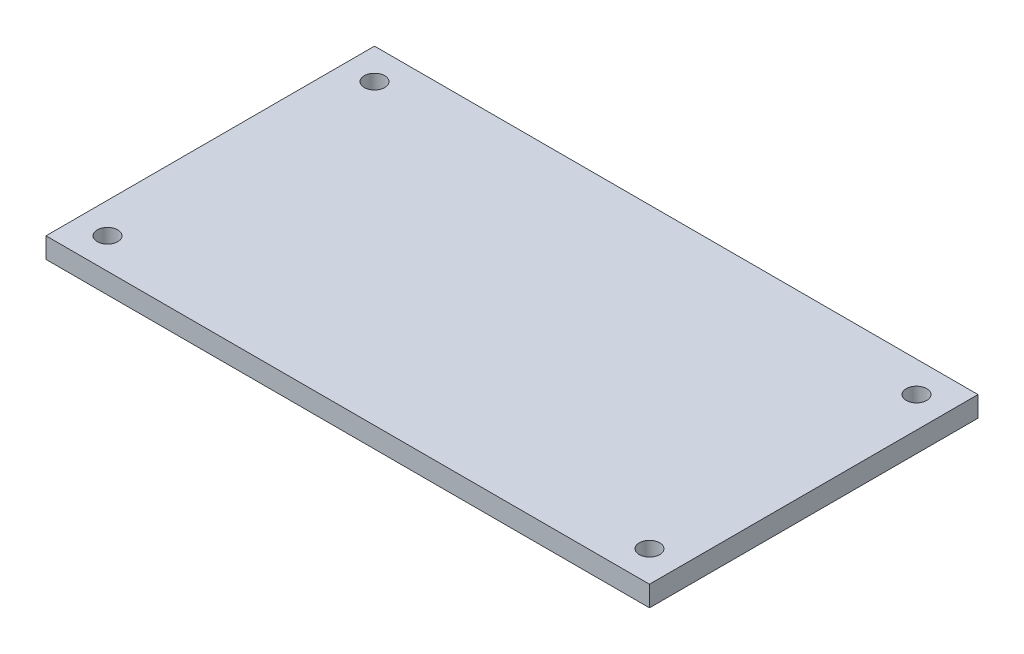
ISO-10303-21;
HEADER;
FILE_DESCRIPTION(('STEP AP214'),'2;1');
FILE_NAME('part.step','',(''),(''),'','','');
FILE_SCHEMA(('AUTOMOTIVE_DESIGN { 1 0 10303 214 1 1 1 1 }'));
ENDSEC;
DATA;
#1=APPLICATION_CONTEXT('core data for automotive mechanical design processes');
#2=APPLICATION_PROTOCOL_DEFINITION('international standard','automotive_design',2000,#1);
#3=PRODUCT_CONTEXT('',#1,'mechanical');
#4=PRODUCT('Part','Part','',(#3));
#5=PRODUCT_RELATED_PRODUCT_CATEGORY('part','',(#4));
#6=PRODUCT_DEFINITION_FORMATION('','',#4);
#7=PRODUCT_DEFINITION_CONTEXT('part definition',#1,'design');
#8=PRODUCT_DEFINITION('design','',#6,#7);
#9=PRODUCT_DEFINITION_SHAPE('','',#8);
#10=(LENGTH_UNIT() NAMED_UNIT(*) SI_UNIT(.MILLI.,.METRE.));
#11=(NAMED_UNIT(*) PLANE_ANGLE_UNIT() SI_UNIT($,.RADIAN.));
#12=(NAMED_UNIT(*) SI_UNIT($,.STERADIAN.) SOLID_ANGLE_UNIT());
#13=UNCERTAINTY_MEASURE_WITH_UNIT(LENGTH_MEASURE(1.E-05),#10,'distance_accuracy_value','');
#14=(GEOMETRIC_REPRESENTATION_CONTEXT(3) GLOBAL_UNCERTAINTY_ASSIGNED_CONTEXT((#13)) GLOBAL_UNIT_ASSIGNED_CONTEXT((#10,
#11,#12)) REPRESENTATION_CONTEXT('',''));
#15=CARTESIAN_POINT('',(0.,0.,0.));
#16=DIRECTION('',(0.,0.,1.));
#17=DIRECTION('',(1.,0.,0.));
#18=AXIS2_PLACEMENT_3D('',#15,#16,#17);
#19=CARTESIAN_POINT('',(0.,2.,-29.04));
#20=DIRECTION('',(0.,0.,-1.));
#21=DIRECTION('',(-1.,0.,0.));
#22=AXIS2_PLACEMENT_3D('',#19,#20,#21);
#23=PLANE('',#22);
#24=DIRECTION('',(1.,0.,0.));
#25=VECTOR('',#24,1.);
#26=CARTESIAN_POINT('',(0.,0.,-29.04));
#27=LINE('',#26,#25);
#28=CARTESIAN_POINT('',(-3.,0.,-29.04));
#29=VERTEX_POINT('',#28);
#30=CARTESIAN_POINT('',(55.86,0.,-29.04));
#31=VERTEX_POINT('',#30);
#32=EDGE_CURVE('E108',#29,#31,#27,.T.);
#33=ORIENTED_EDGE('',*,*,#32,.F.);
#34=DIRECTION('',(0.,-1.,0.));
#35=VECTOR('',#34,1.);
#36=CARTESIAN_POINT('',(-3.,2.,-29.04));
#37=LINE('',#36,#35);
#38=CARTESIAN_POINT('',(-3.,2.,-29.04));
#39=VERTEX_POINT('',#38);
#40=EDGE_CURVE('E11',#39,#29,#37,.T.);
#41=ORIENTED_EDGE('',*,*,#40,.F.);
#42=DIRECTION('',(1.,0.,0.));
#43=VECTOR('',#42,1.);
#44=CARTESIAN_POINT('',(0.,2.,-29.04));
#45=LINE('',#44,#43);
#46=CARTESIAN_POINT('',(55.86,2.,-29.04));
#47=VERTEX_POINT('',#46);
#48=EDGE_CURVE('E84',#39,#47,#45,.T.);
#49=ORIENTED_EDGE('',*,*,#48,.T.);
#50=DIRECTION('',(0.,-1.,0.));
#51=VECTOR('',#50,1.);
#52=CARTESIAN_POINT('',(55.86,2.,-29.04));
#53=LINE('',#52,#51);
#54=EDGE_CURVE('E72',#47,#31,#53,.T.);
#55=ORIENTED_EDGE('',*,*,#54,.T.);
#56=EDGE_LOOP('',(#33,#41,#49,#55));
#57=FACE_BOUND('',#56,.T.);
#58=ADVANCED_FACE('F33',(#57),#23,.T.);
#59=CARTESIAN_POINT('',(-3.,2.,0.));
#60=DIRECTION('',(1.,0.,0.));
#61=DIRECTION('',(0.,0.,-1.));
#62=AXIS2_PLACEMENT_3D('',#59,#60,#61);
#63=PLANE('',#62);
#64=DIRECTION('',(0.,0.,1.));
#65=VECTOR('',#64,1.);
#66=CARTESIAN_POINT('',(-3.,0.,0.));
#67=LINE('',#66,#65);
#68=CARTESIAN_POINT('',(-3.,0.,3.));
#69=VERTEX_POINT('',#68);
#70=EDGE_CURVE('E89',#29,#69,#67,.T.);
#71=ORIENTED_EDGE('',*,*,#70,.T.);
#72=DIRECTION('',(0.,-1.,0.));
#73=VECTOR('',#72,1.);
#74=CARTESIAN_POINT('',(-3.,2.,3.));
#75=LINE('',#74,#73);
#76=CARTESIAN_POINT('',(-3.,2.,3.));
#77=VERTEX_POINT('',#76);
#78=EDGE_CURVE('E41',#77,#69,#75,.T.);
#79=ORIENTED_EDGE('',*,*,#78,.F.);
#80=DIRECTION('',(0.,0.,1.));
#81=VECTOR('',#80,1.);
#82=CARTESIAN_POINT('',(-3.,2.,0.));
#83=LINE('',#82,#81);
#84=EDGE_CURVE('E78',#39,#77,#83,.T.);
#85=ORIENTED_EDGE('',*,*,#84,.F.);
#86=ORIENTED_EDGE('',*,*,#40,.T.);
#87=EDGE_LOOP('',(#71,#79,#85,#86));
#88=FACE_BOUND('',#87,.T.);
#89=ADVANCED_FACE('F87',(#88),#63,.F.);
#90=CARTESIAN_POINT('',(0.,2.,3.));
#91=DIRECTION('',(0.,0.,-1.));
#92=DIRECTION('',(-1.,0.,0.));
#93=AXIS2_PLACEMENT_3D('',#90,#91,#92);
#94=PLANE('',#93);
#95=DIRECTION('',(1.,0.,0.));
#96=VECTOR('',#95,1.);
#97=CARTESIAN_POINT('',(0.,0.,3.));
#98=LINE('',#97,#96);
#99=CARTESIAN_POINT('',(55.86,0.,3.));
#100=VERTEX_POINT('',#99);
#101=EDGE_CURVE('E65',#69,#100,#98,.T.);
#102=ORIENTED_EDGE('',*,*,#101,.T.);
#103=DIRECTION('',(0.,-1.,0.));
#104=VECTOR('',#103,1.);
#105=CARTESIAN_POINT('',(55.86,2.,3.));
#106=LINE('',#105,#104);
#107=CARTESIAN_POINT('',(55.86,2.,3.));
#108=VERTEX_POINT('',#107);
#109=EDGE_CURVE('E90',#108,#100,#106,.T.);
#110=ORIENTED_EDGE('',*,*,#109,.F.);
#111=DIRECTION('',(1.,0.,0.));
#112=VECTOR('',#111,1.);
#113=CARTESIAN_POINT('',(0.,2.,3.));
#114=LINE('',#113,#112);
#115=EDGE_CURVE('E83',#77,#108,#114,.T.);
#116=ORIENTED_EDGE('',*,*,#115,.F.);
#117=ORIENTED_EDGE('',*,*,#78,.T.);
#118=EDGE_LOOP('',(#102,#110,#116,#117));
#119=FACE_BOUND('',#118,.T.);
#120=ADVANCED_FACE('F91',(#119),#94,.F.);
#121=CARTESIAN_POINT('',(0.,2.,-26.04));
#122=DIRECTION('',(0.,-1.,0.));
#123=DIRECTION('',(0.,0.,-1.));
#124=AXIS2_PLACEMENT_3D('',#121,#122,#123);
#125=CYLINDRICAL_SURFACE('',#124,1.);
#126=CARTESIAN_POINT('',(0.,2.,-26.04));
#127=DIRECTION('',(0.,1.,0.));
#128=DIRECTION('',(0.,0.,1.));
#129=AXIS2_PLACEMENT_3D('',#126,#127,#128);
#130=CIRCLE('',#129,1.);
#131=CARTESIAN_POINT('',(0.,2.,-25.04));
#132=VERTEX_POINT('',#131);
#133=EDGE_CURVE('E102',#132,#132,#130,.T.);
#134=ORIENTED_EDGE('',*,*,#133,.T.);
#135=EDGE_LOOP('',(#134));
#136=FACE_BOUND('',#135,.T.);
#137=CARTESIAN_POINT('',(0.,0.,-26.04));
#138=DIRECTION('',(0.,1.,0.));
#139=DIRECTION('',(0.,0.,1.));
#140=AXIS2_PLACEMENT_3D('',#137,#138,#139);
#141=CIRCLE('',#140,1.);
#142=CARTESIAN_POINT('',(0.,0.,-25.04));
#143=VERTEX_POINT('',#142);
#144=EDGE_CURVE('E121',#143,#143,#141,.T.);
#145=ORIENTED_EDGE('',*,*,#144,.F.);
#146=EDGE_LOOP('',(#145));
#147=FACE_BOUND('',#146,.T.);
#148=ADVANCED_FACE('F141',(#136,#147),#125,.F.);
#149=CARTESIAN_POINT('',(52.86,2.,-26.04));
#150=DIRECTION('',(0.,-1.,0.));
#151=DIRECTION('',(0.,0.,-1.));
#152=AXIS2_PLACEMENT_3D('',#149,#150,#151);
#153=CYLINDRICAL_SURFACE('',#152,0.999999999999998);
#154=CARTESIAN_POINT('',(52.86,2.,-26.04));
#155=DIRECTION('',(0.,1.,0.));
#156=DIRECTION('',(0.,0.,1.));
#157=AXIS2_PLACEMENT_3D('',#154,#155,#156);
#158=CIRCLE('',#157,0.999999999999998);
#159=CARTESIAN_POINT('',(52.86,2.,-25.04));
#160=VERTEX_POINT('',#159);
#161=EDGE_CURVE('E99',#160,#160,#158,.T.);
#162=ORIENTED_EDGE('',*,*,#161,.T.);
#163=EDGE_LOOP('',(#162));
#164=FACE_BOUND('',#163,.T.);
#165=CARTESIAN_POINT('',(52.86,0.,-26.04));
#166=DIRECTION('',(0.,1.,0.));
#167=DIRECTION('',(0.,0.,1.));
#168=AXIS2_PLACEMENT_3D('',#165,#166,#167);
#169=CIRCLE('',#168,0.999999999999998);
#170=CARTESIAN_POINT('',(52.86,0.,-25.04));
#171=VERTEX_POINT('',#170);
#172=EDGE_CURVE('E118',#171,#171,#169,.T.);
#173=ORIENTED_EDGE('',*,*,#172,.F.);
#174=EDGE_LOOP('',(#173));
#175=FACE_BOUND('',#174,.T.);
#176=ADVANCED_FACE('F150',(#164,#175),#153,.F.);
#177=CARTESIAN_POINT('',(0.,2.,0.));
#178=DIRECTION('',(0.,-1.,0.));
#179=DIRECTION('',(0.,0.,-1.));
#180=AXIS2_PLACEMENT_3D('',#177,#178,#179);
#181=CYLINDRICAL_SURFACE('',#180,1.);
#182=CARTESIAN_POINT('',(0.,2.,0.));
#183=DIRECTION('',(0.,1.,0.));
#184=DIRECTION('',(0.,0.,1.));
#185=AXIS2_PLACEMENT_3D('',#182,#183,#184);
#186=CIRCLE('',#185,1.);
#187=CARTESIAN_POINT('',(0.,2.,1.));
#188=VERTEX_POINT('',#187);
#189=EDGE_CURVE('E93',#188,#188,#186,.T.);
#190=ORIENTED_EDGE('',*,*,#189,.T.);
#191=EDGE_LOOP('',(#190));
#192=FACE_BOUND('',#191,.T.);
#193=CARTESIAN_POINT('',(0.,0.,0.));
#194=DIRECTION('',(0.,1.,0.));
#195=DIRECTION('',(0.,0.,1.));
#196=AXIS2_PLACEMENT_3D('',#193,#194,#195);
#197=CIRCLE('',#196,1.);
#198=CARTESIAN_POINT('',(0.,0.,1.));
#199=VERTEX_POINT('',#198);
#200=EDGE_CURVE('E115',#199,#199,#197,.T.);
#201=ORIENTED_EDGE('',*,*,#200,.F.);
#202=EDGE_LOOP('',(#201));
#203=FACE_BOUND('',#202,.T.);
#204=ADVANCED_FACE('F147',(#192,#203),#181,.F.);
#205=CARTESIAN_POINT('',(55.86,2.,0.));
#206=DIRECTION('',(-1.,0.,0.));
#207=DIRECTION('',(0.,0.,1.));
#208=AXIS2_PLACEMENT_3D('',#205,#206,#207);
#209=PLANE('',#208);
#210=DIRECTION('',(0.,0.,-1.));
#211=VECTOR('',#210,1.);
#212=CARTESIAN_POINT('',(55.86,0.,0.));
#213=LINE('',#212,#211);
#214=EDGE_CURVE('E113',#100,#31,#213,.T.);
#215=ORIENTED_EDGE('',*,*,#214,.T.);
#216=ORIENTED_EDGE('',*,*,#54,.F.);
#217=DIRECTION('',(0.,0.,-1.));
#218=VECTOR('',#217,1.);
#219=CARTESIAN_POINT('',(55.86,2.,0.));
#220=LINE('',#219,#218);
#221=EDGE_CURVE('E49',#108,#47,#220,.T.);
#222=ORIENTED_EDGE('',*,*,#221,.F.);
#223=ORIENTED_EDGE('',*,*,#109,.T.);
#224=EDGE_LOOP('',(#215,#216,#222,#223));
#225=FACE_BOUND('',#224,.T.);
#226=ADVANCED_FACE('F130',(#225),#209,.F.);
#227=CARTESIAN_POINT('',(52.86,2.,0.));
#228=DIRECTION('',(0.,-1.,0.));
#229=DIRECTION('',(0.,0.,-1.));
#230=AXIS2_PLACEMENT_3D('',#227,#228,#229);
#231=CYLINDRICAL_SURFACE('',#230,0.999999999999998);
#232=CARTESIAN_POINT('',(52.86,2.,0.));
#233=DIRECTION('',(0.,1.,0.));
#234=DIRECTION('',(0.,0.,1.));
#235=AXIS2_PLACEMENT_3D('',#232,#233,#234);
#236=CIRCLE('',#235,0.999999999999998);
#237=CARTESIAN_POINT('',(52.86,2.,0.999999999999998));
#238=VERTEX_POINT('',#237);
#239=EDGE_CURVE('E105',#238,#238,#236,.T.);
#240=ORIENTED_EDGE('',*,*,#239,.T.);
#241=EDGE_LOOP('',(#240));
#242=FACE_BOUND('',#241,.T.);
#243=CARTESIAN_POINT('',(52.86,0.,0.));
#244=DIRECTION('',(0.,1.,0.));
#245=DIRECTION('',(0.,0.,1.));
#246=AXIS2_PLACEMENT_3D('',#243,#244,#245);
#247=CIRCLE('',#246,0.999999999999998);
#248=CARTESIAN_POINT('',(52.86,0.,0.999999999999998));
#249=VERTEX_POINT('',#248);
#250=EDGE_CURVE('E124',#249,#249,#247,.T.);
#251=ORIENTED_EDGE('',*,*,#250,.F.);
#252=EDGE_LOOP('',(#251));
#253=FACE_BOUND('',#252,.T.);
#254=ADVANCED_FACE('F146',(#242,#253),#231,.F.);
#255=CARTESIAN_POINT('',(0.,2.,0.));
#256=DIRECTION('',(0.,1.,0.));
#257=DIRECTION('',(0.,0.,1.));
#258=AXIS2_PLACEMENT_3D('',#255,#256,#257);
#259=PLANE('',#258);
#260=ORIENTED_EDGE('',*,*,#48,.F.);
#261=ORIENTED_EDGE('',*,*,#84,.T.);
#262=ORIENTED_EDGE('',*,*,#115,.T.);
#263=ORIENTED_EDGE('',*,*,#221,.T.);
#264=EDGE_LOOP('',(#260,#261,#262,#263));
#265=FACE_BOUND('',#264,.T.);
#266=ORIENTED_EDGE('',*,*,#189,.F.);
#267=EDGE_LOOP('',(#266));
#268=FACE_BOUND('',#267,.T.);
#269=ORIENTED_EDGE('',*,*,#161,.F.);
#270=EDGE_LOOP('',(#269));
#271=FACE_BOUND('',#270,.T.);
#272=ORIENTED_EDGE('',*,*,#133,.F.);
#273=EDGE_LOOP('',(#272));
#274=FACE_BOUND('',#273,.T.);
#275=ORIENTED_EDGE('',*,*,#239,.F.);
#276=EDGE_LOOP('',(#275));
#277=FACE_BOUND('',#276,.T.);
#278=ADVANCED_FACE('F80',(#265,#268,#271,#274,#277),#259,.T.);
#279=CARTESIAN_POINT('',(0.,0.,0.));
#280=DIRECTION('',(0.,1.,0.));
#281=DIRECTION('',(0.,0.,1.));
#282=AXIS2_PLACEMENT_3D('',#279,#280,#281);
#283=PLANE('',#282);
#284=ORIENTED_EDGE('',*,*,#32,.T.);
#285=ORIENTED_EDGE('',*,*,#214,.F.);
#286=ORIENTED_EDGE('',*,*,#101,.F.);
#287=ORIENTED_EDGE('',*,*,#70,.F.);
#288=EDGE_LOOP('',(#284,#285,#286,#287));
#289=FACE_BOUND('',#288,.T.);
#290=ORIENTED_EDGE('',*,*,#200,.T.);
#291=EDGE_LOOP('',(#290));
#292=FACE_BOUND('',#291,.T.);
#293=ORIENTED_EDGE('',*,*,#172,.T.);
#294=EDGE_LOOP('',(#293));
#295=FACE_BOUND('',#294,.T.);
#296=ORIENTED_EDGE('',*,*,#144,.T.);
#297=EDGE_LOOP('',(#296));
#298=FACE_BOUND('',#297,.T.);
#299=ORIENTED_EDGE('',*,*,#250,.T.);
#300=EDGE_LOOP('',(#299));
#301=FACE_BOUND('',#300,.T.);
#302=ADVANCED_FACE('F132',(#289,#292,#295,#298,#301),#283,.F.);
#303=CLOSED_SHELL('',(#58,#89,#120,#148,#176,#204,#226,#254,#278,#302));
#304=MANIFOLD_SOLID_BREP('B2',#303);
#305=ADVANCED_BREP_SHAPE_REPRESENTATION('',(#18,#304),#14);
#306=SHAPE_DEFINITION_REPRESENTATION(#9,#305);
ENDSEC;
END-ISO-10303-21;
